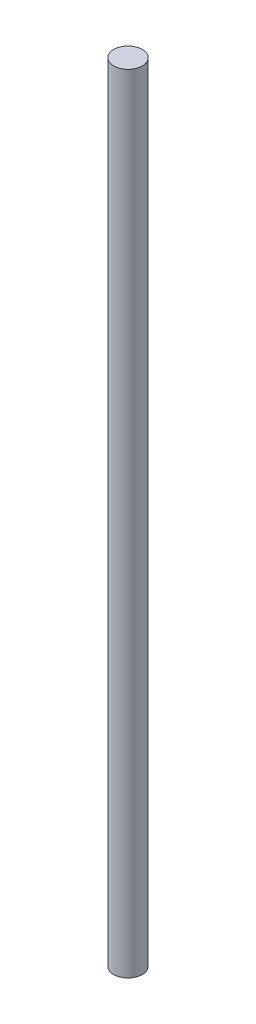
ISO-10303-21;
HEADER;
FILE_DESCRIPTION(('STEP AP214'),'2;1');
FILE_NAME('part.step','',(''),(''),'','','');
FILE_SCHEMA(('AUTOMOTIVE_DESIGN { 1 0 10303 214 1 1 1 1 }'));
ENDSEC;
DATA;
#1=APPLICATION_CONTEXT('core data for automotive mechanical design processes');
#2=APPLICATION_PROTOCOL_DEFINITION('international standard','automotive_design',2000,#1);
#3=PRODUCT_CONTEXT('',#1,'mechanical');
#4=PRODUCT('Part','Part','',(#3));
#5=PRODUCT_RELATED_PRODUCT_CATEGORY('part','',(#4));
#6=PRODUCT_DEFINITION_FORMATION('','',#4);
#7=PRODUCT_DEFINITION_CONTEXT('part definition',#1,'design');
#8=PRODUCT_DEFINITION('design','',#6,#7);
#9=PRODUCT_DEFINITION_SHAPE('','',#8);
#10=(LENGTH_UNIT() NAMED_UNIT(*) SI_UNIT(.MILLI.,.METRE.));
#11=(NAMED_UNIT(*) PLANE_ANGLE_UNIT() SI_UNIT($,.RADIAN.));
#12=(NAMED_UNIT(*) SI_UNIT($,.STERADIAN.) SOLID_ANGLE_UNIT());
#13=UNCERTAINTY_MEASURE_WITH_UNIT(LENGTH_MEASURE(1.E-05),#10,'distance_accuracy_value','');
#14=(GEOMETRIC_REPRESENTATION_CONTEXT(3) GLOBAL_UNCERTAINTY_ASSIGNED_CONTEXT((#13)) GLOBAL_UNIT_ASSIGNED_CONTEXT((#10,
#11,#12)) REPRESENTATION_CONTEXT('',''));
#15=CARTESIAN_POINT('',(0.,0.,0.));
#16=DIRECTION('',(0.,0.,1.));
#17=DIRECTION('',(1.,0.,0.));
#18=AXIS2_PLACEMENT_3D('',#15,#16,#17);
#19=CARTESIAN_POINT('',(0.,16.5,0.));
#20=DIRECTION('',(0.,-1.,0.));
#21=DIRECTION('',(0.,0.,-1.));
#22=AXIS2_PLACEMENT_3D('',#19,#20,#21);
#23=CYLINDRICAL_SURFACE('',#22,0.3);
#24=CARTESIAN_POINT('',(0.,16.5,0.));
#25=DIRECTION('',(0.,1.,0.));
#26=DIRECTION('',(0.,0.,1.));
#27=AXIS2_PLACEMENT_3D('',#24,#25,#26);
#28=CIRCLE('',#27,0.3);
#29=CARTESIAN_POINT('',(0.,16.5,0.3));
#30=VERTEX_POINT('',#29);
#31=EDGE_CURVE('E10',#30,#30,#28,.T.);
#32=ORIENTED_EDGE('',*,*,#31,.F.);
#33=EDGE_LOOP('',(#32));
#34=FACE_BOUND('',#33,.T.);
#35=CARTESIAN_POINT('',(0.,0.,0.));
#36=DIRECTION('',(0.,1.,0.));
#37=DIRECTION('',(0.,0.,1.));
#38=AXIS2_PLACEMENT_3D('',#35,#36,#37);
#39=CIRCLE('',#38,0.3);
#40=CARTESIAN_POINT('',(0.,0.,0.3));
#41=VERTEX_POINT('',#40);
#42=EDGE_CURVE('E34',#41,#41,#39,.T.);
#43=ORIENTED_EDGE('',*,*,#42,.T.);
#44=EDGE_LOOP('',(#43));
#45=FACE_BOUND('',#44,.T.);
#46=ADVANCED_FACE('F31',(#34,#45),#23,.T.);
#47=CARTESIAN_POINT('',(0.,16.5,0.));
#48=DIRECTION('',(0.,1.,0.));
#49=DIRECTION('',(0.,0.,1.));
#50=AXIS2_PLACEMENT_3D('',#47,#48,#49);
#51=PLANE('',#50);
#52=ORIENTED_EDGE('',*,*,#31,.T.);
#53=EDGE_LOOP('',(#52));
#54=FACE_BOUND('',#53,.T.);
#55=ADVANCED_FACE('F46',(#54),#51,.T.);
#56=CARTESIAN_POINT('',(0.,0.,0.));
#57=DIRECTION('',(0.,1.,0.));
#58=DIRECTION('',(0.,0.,1.));
#59=AXIS2_PLACEMENT_3D('',#56,#57,#58);
#60=PLANE('',#59);
#61=ORIENTED_EDGE('',*,*,#42,.F.);
#62=EDGE_LOOP('',(#61));
#63=FACE_BOUND('',#62,.T.);
#64=ADVANCED_FACE('F44',(#63),#60,.F.);
#65=CLOSED_SHELL('',(#46,#55,#64));
#66=MANIFOLD_SOLID_BREP('B2',#65);
#67=ADVANCED_BREP_SHAPE_REPRESENTATION('',(#18,#66),#14);
#68=SHAPE_DEFINITION_REPRESENTATION(#9,#67);
ENDSEC;
END-ISO-10303-21;
